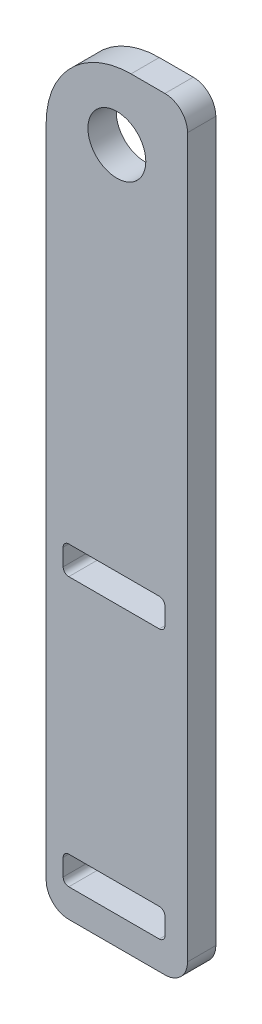
ISO-10303-21;
HEADER;
FILE_DESCRIPTION(('STEP AP214'),'2;1');
FILE_NAME('part.step','',(''),(''),'','','');
FILE_SCHEMA(('AUTOMOTIVE_DESIGN { 1 0 10303 214 1 1 1 1 }'));
ENDSEC;
DATA;
#1=APPLICATION_CONTEXT('core data for automotive mechanical design processes');
#2=APPLICATION_PROTOCOL_DEFINITION('international standard','automotive_design',2000,#1);
#3=PRODUCT_CONTEXT('',#1,'mechanical');
#4=PRODUCT('Part','Part','',(#3));
#5=PRODUCT_RELATED_PRODUCT_CATEGORY('part','',(#4));
#6=PRODUCT_DEFINITION_FORMATION('','',#4);
#7=PRODUCT_DEFINITION_CONTEXT('part definition',#1,'design');
#8=PRODUCT_DEFINITION('design','',#6,#7);
#9=PRODUCT_DEFINITION_SHAPE('','',#8);
#10=(LENGTH_UNIT() NAMED_UNIT(*) SI_UNIT(.MILLI.,.METRE.));
#11=(NAMED_UNIT(*) PLANE_ANGLE_UNIT() SI_UNIT($,.RADIAN.));
#12=(NAMED_UNIT(*) SI_UNIT($,.STERADIAN.) SOLID_ANGLE_UNIT());
#13=UNCERTAINTY_MEASURE_WITH_UNIT(LENGTH_MEASURE(1.E-05),#10,'distance_accuracy_value','');
#14=(GEOMETRIC_REPRESENTATION_CONTEXT(3) GLOBAL_UNCERTAINTY_ASSIGNED_CONTEXT((#13)) GLOBAL_UNIT_ASSIGNED_CONTEXT((#10,
#11,#12)) REPRESENTATION_CONTEXT('',''));
#15=CARTESIAN_POINT('',(0.,0.,0.));
#16=DIRECTION('',(0.,0.,1.));
#17=DIRECTION('',(1.,0.,0.));
#18=AXIS2_PLACEMENT_3D('',#15,#16,#17);
#19=CARTESIAN_POINT('',(1.5875,-1.830947062,3.175));
#20=DIRECTION('',(0.,0.,-1.));
#21=DIRECTION('',(-1.,0.,0.));
#22=AXIS2_PLACEMENT_3D('',#19,#20,#21);
#23=PLANE('',#22);
#24=CARTESIAN_POINT('',(4.76249999999999,-74.220947062,3.175));
#25=DIRECTION('',(0.,0.,1.));
#26=DIRECTION('',(-1.,0.,0.));
#27=AXIS2_PLACEMENT_3D('',#24,#25,#26);
#28=CIRCLE('',#27,0.634999999999999);
#29=CARTESIAN_POINT('',(4.76249999999999,-74.855947062,3.175));
#30=VERTEX_POINT('',#29);
#31=CARTESIAN_POINT('',(5.39749999999999,-74.220947062,3.175));
#32=VERTEX_POINT('',#31);
#33=EDGE_CURVE('E290',#30,#32,#28,.T.);
#34=ORIENTED_EDGE('',*,*,#33,.F.);
#35=DIRECTION('',(1.,0.,0.));
#36=VECTOR('',#35,1.);
#37=CARTESIAN_POINT('',(-5.39749999999999,-74.855947062,3.175));
#38=LINE('',#37,#36);
#39=CARTESIAN_POINT('',(-5.39749999999999,-74.855947062,3.175));
#40=VERTEX_POINT('',#39);
#41=EDGE_CURVE('E313',#40,#30,#38,.T.);
#42=ORIENTED_EDGE('',*,*,#41,.F.);
#43=CARTESIAN_POINT('',(-5.39749999999999,-74.220947062,3.175));
#44=DIRECTION('',(0.,0.,1.));
#45=DIRECTION('',(-1.,0.,0.));
#46=AXIS2_PLACEMENT_3D('',#43,#44,#45);
#47=CIRCLE('',#46,0.634999999999999);
#48=CARTESIAN_POINT('',(-6.03249999999999,-74.220947062,3.175));
#49=VERTEX_POINT('',#48);
#50=EDGE_CURVE('E309',#49,#40,#47,.T.);
#51=ORIENTED_EDGE('',*,*,#50,.F.);
#52=DIRECTION('',(0.,-1.,0.));
#53=VECTOR('',#52,1.);
#54=CARTESIAN_POINT('',(-6.0325,-72.315947062,3.175));
#55=LINE('',#54,#53);
#56=CARTESIAN_POINT('',(-6.0325,-72.315947062,3.175));
#57=VERTEX_POINT('',#56);
#58=EDGE_CURVE('E306',#57,#49,#55,.T.);
#59=ORIENTED_EDGE('',*,*,#58,.F.);
#60=CARTESIAN_POINT('',(-5.3975,-72.315947062,3.175));
#61=DIRECTION('',(0.,0.,1.));
#62=DIRECTION('',(-1.,0.,0.));
#63=AXIS2_PLACEMENT_3D('',#60,#61,#62);
#64=CIRCLE('',#63,0.634999999999998);
#65=CARTESIAN_POINT('',(-5.3975,-71.680947062,3.175));
#66=VERTEX_POINT('',#65);
#67=EDGE_CURVE('E303',#66,#57,#64,.T.);
#68=ORIENTED_EDGE('',*,*,#67,.F.);
#69=DIRECTION('',(-1.,0.,0.));
#70=VECTOR('',#69,1.);
#71=CARTESIAN_POINT('',(-5.3975,-71.680947062,3.175));
#72=LINE('',#71,#70);
#73=CARTESIAN_POINT('',(4.7625,-71.680947062,3.175));
#74=VERTEX_POINT('',#73);
#75=EDGE_CURVE('E300',#74,#66,#72,.T.);
#76=ORIENTED_EDGE('',*,*,#75,.F.);
#77=CARTESIAN_POINT('',(4.7625,-72.315947062,3.175));
#78=DIRECTION('',(0.,0.,1.));
#79=DIRECTION('',(1.,0.,0.));
#80=AXIS2_PLACEMENT_3D('',#77,#78,#79);
#81=CIRCLE('',#80,0.634999999999999);
#82=CARTESIAN_POINT('',(5.3975,-72.315947062,3.175));
#83=VERTEX_POINT('',#82);
#84=EDGE_CURVE('E297',#83,#74,#81,.T.);
#85=ORIENTED_EDGE('',*,*,#84,.F.);
#86=DIRECTION('',(0.,1.,0.));
#87=VECTOR('',#86,1.);
#88=CARTESIAN_POINT('',(5.3975,-72.315947062,3.175));
#89=LINE('',#88,#87);
#90=EDGE_CURVE('E293',#32,#83,#89,.T.);
#91=ORIENTED_EDGE('',*,*,#90,.F.);
#92=EDGE_LOOP('',(#34,#42,#51,#59,#68,#76,#85,#91));
#93=FACE_BOUND('',#92,.T.);
#94=CARTESIAN_POINT('',(1.5875,-1.830947062,3.175));
#95=DIRECTION('',(0.,0.,1.));
#96=DIRECTION('',(-1.,0.,0.));
#97=AXIS2_PLACEMENT_3D('',#94,#95,#96);
#98=CIRCLE('',#97,9.525);
#99=CARTESIAN_POINT('',(1.5875,7.694052938,3.175));
#100=VERTEX_POINT('',#99);
#101=CARTESIAN_POINT('',(-7.9375,-1.830947062,3.175));
#102=VERTEX_POINT('',#101);
#103=EDGE_CURVE('E381',#100,#102,#98,.T.);
#104=ORIENTED_EDGE('',*,*,#103,.T.);
#105=DIRECTION('',(0.,-1.,0.));
#106=VECTOR('',#105,1.);
#107=CARTESIAN_POINT('',(-7.9375,-1.830947062,3.175));
#108=LINE('',#107,#106);
#109=CARTESIAN_POINT('',(-7.93749999999999,-75.490947062,3.175));
#110=VERTEX_POINT('',#109);
#111=EDGE_CURVE('E385',#102,#110,#108,.T.);
#112=ORIENTED_EDGE('',*,*,#111,.T.);
#113=CARTESIAN_POINT('',(-5.39749999999999,-75.490947062,3.175));
#114=DIRECTION('',(0.,0.,1.));
#115=DIRECTION('',(-1.,0.,0.));
#116=AXIS2_PLACEMENT_3D('',#113,#114,#115);
#117=CIRCLE('',#116,2.54);
#118=CARTESIAN_POINT('',(-5.39749999999999,-78.030947062,3.175));
#119=VERTEX_POINT('',#118);
#120=EDGE_CURVE('E389',#110,#119,#117,.T.);
#121=ORIENTED_EDGE('',*,*,#120,.T.);
#122=DIRECTION('',(1.,0.,0.));
#123=VECTOR('',#122,1.);
#124=CARTESIAN_POINT('',(-5.39749999999999,-78.030947062,3.175));
#125=LINE('',#124,#123);
#126=CARTESIAN_POINT('',(5.39749999999999,-78.030947062,3.175));
#127=VERTEX_POINT('',#126);
#128=EDGE_CURVE('E392',#119,#127,#125,.T.);
#129=ORIENTED_EDGE('',*,*,#128,.T.);
#130=CARTESIAN_POINT('',(5.39749999999999,-75.490947062,3.175));
#131=DIRECTION('',(0.,0.,1.));
#132=DIRECTION('',(-1.,0.,0.));
#133=AXIS2_PLACEMENT_3D('',#130,#131,#132);
#134=CIRCLE('',#133,2.54);
#135=CARTESIAN_POINT('',(7.93749999999999,-75.490947062,3.175));
#136=VERTEX_POINT('',#135);
#137=EDGE_CURVE('E395',#127,#136,#134,.T.);
#138=ORIENTED_EDGE('',*,*,#137,.T.);
#139=DIRECTION('',(0.,1.,0.));
#140=VECTOR('',#139,1.);
#141=CARTESIAN_POINT('',(7.93749999999999,-75.490947062,3.175));
#142=LINE('',#141,#140);
#143=CARTESIAN_POINT('',(7.9375,5.154052938,3.175));
#144=VERTEX_POINT('',#143);
#145=EDGE_CURVE('E398',#136,#144,#142,.T.);
#146=ORIENTED_EDGE('',*,*,#145,.T.);
#147=CARTESIAN_POINT('',(5.3975,5.154052938,3.175));
#148=DIRECTION('',(0.,0.,1.));
#149=DIRECTION('',(1.,0.,0.));
#150=AXIS2_PLACEMENT_3D('',#147,#148,#149);
#151=CIRCLE('',#150,2.54);
#152=CARTESIAN_POINT('',(5.3975,7.694052938,3.175));
#153=VERTEX_POINT('',#152);
#154=EDGE_CURVE('E401',#144,#153,#151,.T.);
#155=ORIENTED_EDGE('',*,*,#154,.T.);
#156=DIRECTION('',(-1.,0.,0.));
#157=VECTOR('',#156,1.);
#158=CARTESIAN_POINT('',(1.5875,7.694052938,3.175));
#159=LINE('',#158,#157);
#160=EDGE_CURVE('E404',#153,#100,#159,.T.);
#161=ORIENTED_EDGE('',*,*,#160,.T.);
#162=EDGE_LOOP('',(#104,#112,#121,#129,#138,#146,#155,#161));
#163=FACE_BOUND('',#162,.T.);
#164=CARTESIAN_POINT('',(0.,0.,3.175));
#165=DIRECTION('',(0.,0.,1.));
#166=DIRECTION('',(1.,0.,0.));
#167=AXIS2_PLACEMENT_3D('',#164,#165,#166);
#168=CIRCLE('',#167,3.25);
#169=CARTESIAN_POINT('',(3.25,0.,3.175));
#170=VERTEX_POINT('',#169);
#171=EDGE_CURVE('E373',#170,#170,#168,.T.);
#172=ORIENTED_EDGE('',*,*,#171,.F.);
#173=EDGE_LOOP('',(#172));
#174=FACE_BOUND('',#173,.T.);
#175=CARTESIAN_POINT('',(-5.3975,-42.153447062,3.175));
#176=DIRECTION('',(0.,0.,1.));
#177=DIRECTION('',(1.,0.,0.));
#178=AXIS2_PLACEMENT_3D('',#175,#176,#177);
#179=CIRCLE('',#178,0.634999999999999);
#180=CARTESIAN_POINT('',(-5.3975,-41.518447062,3.175));
#181=VERTEX_POINT('',#180);
#182=CARTESIAN_POINT('',(-6.0325,-42.153447062,3.175));
#183=VERTEX_POINT('',#182);
#184=EDGE_CURVE('E201',#181,#183,#179,.T.);
#185=ORIENTED_EDGE('',*,*,#184,.F.);
#186=DIRECTION('',(-1.,0.,0.));
#187=VECTOR('',#186,1.);
#188=CARTESIAN_POINT('',(-5.3975,-41.518447062,3.175));
#189=LINE('',#188,#187);
#190=CARTESIAN_POINT('',(4.7625,-41.518447062,3.175));
#191=VERTEX_POINT('',#190);
#192=EDGE_CURVE('E242',#191,#181,#189,.T.);
#193=ORIENTED_EDGE('',*,*,#192,.F.);
#194=CARTESIAN_POINT('',(4.7625,-42.153447062,3.175));
#195=DIRECTION('',(0.,0.,1.));
#196=DIRECTION('',(1.,0.,0.));
#197=AXIS2_PLACEMENT_3D('',#194,#195,#196);
#198=CIRCLE('',#197,0.634999999999998);
#199=CARTESIAN_POINT('',(5.3975,-42.153447062,3.175));
#200=VERTEX_POINT('',#199);
#201=EDGE_CURVE('E239',#200,#191,#198,.T.);
#202=ORIENTED_EDGE('',*,*,#201,.F.);
#203=DIRECTION('',(0.,1.,0.));
#204=VECTOR('',#203,1.);
#205=CARTESIAN_POINT('',(5.3975,-44.058447062,3.175));
#206=LINE('',#205,#204);
#207=CARTESIAN_POINT('',(5.3975,-44.058447062,3.175));
#208=VERTEX_POINT('',#207);
#209=EDGE_CURVE('E236',#208,#200,#206,.T.);
#210=ORIENTED_EDGE('',*,*,#209,.F.);
#211=CARTESIAN_POINT('',(4.7625,-44.058447062,3.175));
#212=DIRECTION('',(0.,0.,1.));
#213=DIRECTION('',(-1.,0.,0.));
#214=AXIS2_PLACEMENT_3D('',#211,#212,#213);
#215=CIRCLE('',#214,0.634999999999999);
#216=CARTESIAN_POINT('',(4.7625,-44.693447062,3.175));
#217=VERTEX_POINT('',#216);
#218=EDGE_CURVE('E233',#217,#208,#215,.T.);
#219=ORIENTED_EDGE('',*,*,#218,.F.);
#220=DIRECTION('',(1.,0.,0.));
#221=VECTOR('',#220,1.);
#222=CARTESIAN_POINT('',(-5.3975,-44.693447062,3.175));
#223=LINE('',#222,#221);
#224=CARTESIAN_POINT('',(-5.3975,-44.693447062,3.175));
#225=VERTEX_POINT('',#224);
#226=EDGE_CURVE('E228',#225,#217,#223,.T.);
#227=ORIENTED_EDGE('',*,*,#226,.F.);
#228=CARTESIAN_POINT('',(-5.3975,-44.058447062,3.175));
#229=DIRECTION('',(0.,0.,1.));
#230=DIRECTION('',(1.,0.,0.));
#231=AXIS2_PLACEMENT_3D('',#228,#229,#230);
#232=CIRCLE('',#231,0.634999999999998);
#233=CARTESIAN_POINT('',(-6.0325,-44.058447062,3.175));
#234=VERTEX_POINT('',#233);
#235=EDGE_CURVE('E224',#234,#225,#232,.T.);
#236=ORIENTED_EDGE('',*,*,#235,.F.);
#237=DIRECTION('',(0.,-1.,0.));
#238=VECTOR('',#237,1.);
#239=CARTESIAN_POINT('',(-6.0325,-44.058447062,3.175));
#240=LINE('',#239,#238);
#241=EDGE_CURVE('E210',#183,#234,#240,.T.);
#242=ORIENTED_EDGE('',*,*,#241,.F.);
#243=EDGE_LOOP('',(#185,#193,#202,#210,#219,#227,#236,#242));
#244=FACE_BOUND('',#243,.T.);
#245=ADVANCED_FACE('F39',(#93,#163,#174,#244),#23,.F.);
#246=CARTESIAN_POINT('',(1.5875,-1.830947062,0.));
#247=DIRECTION('',(0.,0.,-1.));
#248=DIRECTION('',(-1.,0.,0.));
#249=AXIS2_PLACEMENT_3D('',#246,#247,#248);
#250=PLANE('',#249);
#251=CARTESIAN_POINT('',(1.5875,-1.830947062,0.));
#252=DIRECTION('',(0.,0.,1.));
#253=DIRECTION('',(-1.,0.,0.));
#254=AXIS2_PLACEMENT_3D('',#251,#252,#253);
#255=CIRCLE('',#254,9.525);
#256=CARTESIAN_POINT('',(1.5875,7.694052938,0.));
#257=VERTEX_POINT('',#256);
#258=CARTESIAN_POINT('',(-7.9375,-1.830947062,0.));
#259=VERTEX_POINT('',#258);
#260=EDGE_CURVE('E377',#257,#259,#255,.T.);
#261=ORIENTED_EDGE('',*,*,#260,.F.);
#262=DIRECTION('',(-1.,0.,0.));
#263=VECTOR('',#262,1.);
#264=CARTESIAN_POINT('',(1.5875,7.694052938,0.));
#265=LINE('',#264,#263);
#266=CARTESIAN_POINT('',(5.3975,7.694052938,0.));
#267=VERTEX_POINT('',#266);
#268=EDGE_CURVE('E386',#267,#257,#265,.T.);
#269=ORIENTED_EDGE('',*,*,#268,.F.);
#270=CARTESIAN_POINT('',(5.3975,5.154052938,0.));
#271=DIRECTION('',(0.,0.,1.));
#272=DIRECTION('',(1.,0.,0.));
#273=AXIS2_PLACEMENT_3D('',#270,#271,#272);
#274=CIRCLE('',#273,2.54);
#275=CARTESIAN_POINT('',(7.9375,5.154052938,0.));
#276=VERTEX_POINT('',#275);
#277=EDGE_CURVE('E426',#276,#267,#274,.T.);
#278=ORIENTED_EDGE('',*,*,#277,.F.);
#279=DIRECTION('',(0.,1.,0.));
#280=VECTOR('',#279,1.);
#281=CARTESIAN_POINT('',(7.93749999999999,-75.490947062,0.));
#282=LINE('',#281,#280);
#283=CARTESIAN_POINT('',(7.93749999999999,-75.490947062,0.));
#284=VERTEX_POINT('',#283);
#285=EDGE_CURVE('E423',#284,#276,#282,.T.);
#286=ORIENTED_EDGE('',*,*,#285,.F.);
#287=CARTESIAN_POINT('',(5.39749999999999,-75.490947062,0.));
#288=DIRECTION('',(0.,0.,1.));
#289=DIRECTION('',(-1.,0.,0.));
#290=AXIS2_PLACEMENT_3D('',#287,#288,#289);
#291=CIRCLE('',#290,2.54);
#292=CARTESIAN_POINT('',(5.39749999999999,-78.030947062,0.));
#293=VERTEX_POINT('',#292);
#294=EDGE_CURVE('E420',#293,#284,#291,.T.);
#295=ORIENTED_EDGE('',*,*,#294,.F.);
#296=DIRECTION('',(1.,0.,0.));
#297=VECTOR('',#296,1.);
#298=CARTESIAN_POINT('',(-5.39749999999999,-78.030947062,0.));
#299=LINE('',#298,#297);
#300=CARTESIAN_POINT('',(-5.39749999999999,-78.030947062,0.));
#301=VERTEX_POINT('',#300);
#302=EDGE_CURVE('E417',#301,#293,#299,.T.);
#303=ORIENTED_EDGE('',*,*,#302,.F.);
#304=CARTESIAN_POINT('',(-5.39749999999999,-75.490947062,0.));
#305=DIRECTION('',(0.,0.,1.));
#306=DIRECTION('',(-1.,0.,0.));
#307=AXIS2_PLACEMENT_3D('',#304,#305,#306);
#308=CIRCLE('',#307,2.54);
#309=CARTESIAN_POINT('',(-7.93749999999999,-75.490947062,0.));
#310=VERTEX_POINT('',#309);
#311=EDGE_CURVE('E414',#310,#301,#308,.T.);
#312=ORIENTED_EDGE('',*,*,#311,.F.);
#313=DIRECTION('',(0.,-1.,0.));
#314=VECTOR('',#313,1.);
#315=CARTESIAN_POINT('',(-7.9375,-1.830947062,0.));
#316=LINE('',#315,#314);
#317=EDGE_CURVE('E411',#259,#310,#316,.T.);
#318=ORIENTED_EDGE('',*,*,#317,.F.);
#319=EDGE_LOOP('',(#261,#269,#278,#286,#295,#303,#312,#318));
#320=FACE_BOUND('',#319,.T.);
#321=CARTESIAN_POINT('',(0.,0.,0.));
#322=DIRECTION('',(0.,0.,1.));
#323=DIRECTION('',(1.,0.,0.));
#324=AXIS2_PLACEMENT_3D('',#321,#322,#323);
#325=CIRCLE('',#324,3.25);
#326=CARTESIAN_POINT('',(3.25,0.,0.));
#327=VERTEX_POINT('',#326);
#328=EDGE_CURVE('E372',#327,#327,#325,.T.);
#329=ORIENTED_EDGE('',*,*,#328,.T.);
#330=EDGE_LOOP('',(#329));
#331=FACE_BOUND('',#330,.T.);
#332=DIRECTION('',(1.,0.,0.));
#333=VECTOR('',#332,1.);
#334=CARTESIAN_POINT('',(-5.39749999999999,-74.855947062,0.));
#335=LINE('',#334,#333);
#336=CARTESIAN_POINT('',(-5.39749999999999,-74.855947062,0.));
#337=VERTEX_POINT('',#336);
#338=CARTESIAN_POINT('',(4.76249999999999,-74.855947062,0.));
#339=VERTEX_POINT('',#338);
#340=EDGE_CURVE('E294',#337,#339,#335,.T.);
#341=ORIENTED_EDGE('',*,*,#340,.T.);
#342=CARTESIAN_POINT('',(4.76249999999999,-74.220947062,0.));
#343=DIRECTION('',(0.,0.,1.));
#344=DIRECTION('',(-1.,0.,0.));
#345=AXIS2_PLACEMENT_3D('',#342,#343,#344);
#346=CIRCLE('',#345,0.634999999999999);
#347=CARTESIAN_POINT('',(5.39749999999999,-74.220947062,0.));
#348=VERTEX_POINT('',#347);
#349=EDGE_CURVE('E219',#339,#348,#346,.T.);
#350=ORIENTED_EDGE('',*,*,#349,.T.);
#351=DIRECTION('',(0.,1.,0.));
#352=VECTOR('',#351,1.);
#353=CARTESIAN_POINT('',(5.3975,-72.315947062,0.));
#354=LINE('',#353,#352);
#355=CARTESIAN_POINT('',(5.3975,-72.315947062,0.));
#356=VERTEX_POINT('',#355);
#357=EDGE_CURVE('E320',#348,#356,#354,.T.);
#358=ORIENTED_EDGE('',*,*,#357,.T.);
#359=CARTESIAN_POINT('',(4.7625,-72.315947062,0.));
#360=DIRECTION('',(0.,0.,1.));
#361=DIRECTION('',(1.,0.,0.));
#362=AXIS2_PLACEMENT_3D('',#359,#360,#361);
#363=CIRCLE('',#362,0.634999999999999);
#364=CARTESIAN_POINT('',(4.7625,-71.680947062,0.));
#365=VERTEX_POINT('',#364);
#366=EDGE_CURVE('E324',#356,#365,#363,.T.);
#367=ORIENTED_EDGE('',*,*,#366,.T.);
#368=DIRECTION('',(-1.,0.,0.));
#369=VECTOR('',#368,1.);
#370=CARTESIAN_POINT('',(-5.3975,-71.680947062,0.));
#371=LINE('',#370,#369);
#372=CARTESIAN_POINT('',(-5.3975,-71.680947062,0.));
#373=VERTEX_POINT('',#372);
#374=EDGE_CURVE('E328',#365,#373,#371,.T.);
#375=ORIENTED_EDGE('',*,*,#374,.T.);
#376=CARTESIAN_POINT('',(-5.3975,-72.315947062,0.));
#377=DIRECTION('',(0.,0.,1.));
#378=DIRECTION('',(-1.,0.,0.));
#379=AXIS2_PLACEMENT_3D('',#376,#377,#378);
#380=CIRCLE('',#379,0.634999999999998);
#381=CARTESIAN_POINT('',(-6.0325,-72.315947062,0.));
#382=VERTEX_POINT('',#381);
#383=EDGE_CURVE('E332',#373,#382,#380,.T.);
#384=ORIENTED_EDGE('',*,*,#383,.T.);
#385=DIRECTION('',(0.,-1.,0.));
#386=VECTOR('',#385,1.);
#387=CARTESIAN_POINT('',(-6.0325,-72.315947062,0.));
#388=LINE('',#387,#386);
#389=CARTESIAN_POINT('',(-6.03249999999999,-74.220947062,0.));
#390=VERTEX_POINT('',#389);
#391=EDGE_CURVE('E336',#382,#390,#388,.T.);
#392=ORIENTED_EDGE('',*,*,#391,.T.);
#393=CARTESIAN_POINT('',(-5.39749999999999,-74.220947062,0.));
#394=DIRECTION('',(0.,0.,1.));
#395=DIRECTION('',(-1.,0.,0.));
#396=AXIS2_PLACEMENT_3D('',#393,#394,#395);
#397=CIRCLE('',#396,0.634999999999999);
#398=EDGE_CURVE('E340',#390,#337,#397,.T.);
#399=ORIENTED_EDGE('',*,*,#398,.T.);
#400=EDGE_LOOP('',(#341,#350,#358,#367,#375,#384,#392,#399));
#401=FACE_BOUND('',#400,.T.);
#402=DIRECTION('',(-1.,0.,0.));
#403=VECTOR('',#402,1.);
#404=CARTESIAN_POINT('',(-5.3975,-41.518447062,0.));
#405=LINE('',#404,#403);
#406=CARTESIAN_POINT('',(4.7625,-41.518447062,0.));
#407=VERTEX_POINT('',#406);
#408=CARTESIAN_POINT('',(-5.3975,-41.518447062,0.));
#409=VERTEX_POINT('',#408);
#410=EDGE_CURVE('E211',#407,#409,#405,.T.);
#411=ORIENTED_EDGE('',*,*,#410,.T.);
#412=CARTESIAN_POINT('',(-5.3975,-42.153447062,0.));
#413=DIRECTION('',(0.,0.,1.));
#414=DIRECTION('',(1.,0.,0.));
#415=AXIS2_PLACEMENT_3D('',#412,#413,#414);
#416=CIRCLE('',#415,0.634999999999999);
#417=CARTESIAN_POINT('',(-6.0325,-42.153447062,0.));
#418=VERTEX_POINT('',#417);
#419=EDGE_CURVE('E63',#409,#418,#416,.T.);
#420=ORIENTED_EDGE('',*,*,#419,.T.);
#421=DIRECTION('',(0.,-1.,0.));
#422=VECTOR('',#421,1.);
#423=CARTESIAN_POINT('',(-6.0325,-44.058447062,0.));
#424=LINE('',#423,#422);
#425=CARTESIAN_POINT('',(-6.0325,-44.058447062,0.));
#426=VERTEX_POINT('',#425);
#427=EDGE_CURVE('E217',#418,#426,#424,.T.);
#428=ORIENTED_EDGE('',*,*,#427,.T.);
#429=CARTESIAN_POINT('',(-5.3975,-44.058447062,0.));
#430=DIRECTION('',(0.,0.,1.));
#431=DIRECTION('',(1.,0.,0.));
#432=AXIS2_PLACEMENT_3D('',#429,#430,#431);
#433=CIRCLE('',#432,0.634999999999998);
#434=CARTESIAN_POINT('',(-5.3975,-44.693447062,0.));
#435=VERTEX_POINT('',#434);
#436=EDGE_CURVE('E249',#426,#435,#433,.T.);
#437=ORIENTED_EDGE('',*,*,#436,.T.);
#438=DIRECTION('',(1.,0.,0.));
#439=VECTOR('',#438,1.);
#440=CARTESIAN_POINT('',(-5.3975,-44.693447062,0.));
#441=LINE('',#440,#439);
#442=CARTESIAN_POINT('',(4.7625,-44.693447062,0.));
#443=VERTEX_POINT('',#442);
#444=EDGE_CURVE('E253',#435,#443,#441,.T.);
#445=ORIENTED_EDGE('',*,*,#444,.T.);
#446=CARTESIAN_POINT('',(4.7625,-44.058447062,0.));
#447=DIRECTION('',(0.,0.,1.));
#448=DIRECTION('',(-1.,0.,0.));
#449=AXIS2_PLACEMENT_3D('',#446,#447,#448);
#450=CIRCLE('',#449,0.634999999999999);
#451=CARTESIAN_POINT('',(5.3975,-44.058447062,0.));
#452=VERTEX_POINT('',#451);
#453=EDGE_CURVE('E257',#443,#452,#450,.T.);
#454=ORIENTED_EDGE('',*,*,#453,.T.);
#455=DIRECTION('',(0.,1.,0.));
#456=VECTOR('',#455,1.);
#457=CARTESIAN_POINT('',(5.3975,-44.058447062,0.));
#458=LINE('',#457,#456);
#459=CARTESIAN_POINT('',(5.3975,-42.153447062,0.));
#460=VERTEX_POINT('',#459);
#461=EDGE_CURVE('E261',#452,#460,#458,.T.);
#462=ORIENTED_EDGE('',*,*,#461,.T.);
#463=CARTESIAN_POINT('',(4.7625,-42.153447062,0.));
#464=DIRECTION('',(0.,0.,1.));
#465=DIRECTION('',(1.,0.,0.));
#466=AXIS2_PLACEMENT_3D('',#463,#464,#465);
#467=CIRCLE('',#466,0.634999999999998);
#468=EDGE_CURVE('E265',#460,#407,#467,.T.);
#469=ORIENTED_EDGE('',*,*,#468,.T.);
#470=EDGE_LOOP('',(#411,#420,#428,#437,#445,#454,#462,#469));
#471=FACE_BOUND('',#470,.T.);
#472=ADVANCED_FACE('F465',(#320,#331,#401,#471),#250,.T.);
#473=CARTESIAN_POINT('',(1.5875,-1.830947062,3.175));
#474=DIRECTION('',(0.,0.,-1.));
#475=DIRECTION('',(-1.,0.,0.));
#476=AXIS2_PLACEMENT_3D('',#473,#474,#475);
#477=CYLINDRICAL_SURFACE('',#476,9.525);
#478=ORIENTED_EDGE('',*,*,#260,.T.);
#479=DIRECTION('',(0.,0.,-1.));
#480=VECTOR('',#479,1.);
#481=CARTESIAN_POINT('',(-7.9375,-1.830947062,3.175));
#482=LINE('',#481,#480);
#483=EDGE_CURVE('E11',#102,#259,#482,.T.);
#484=ORIENTED_EDGE('',*,*,#483,.F.);
#485=ORIENTED_EDGE('',*,*,#103,.F.);
#486=DIRECTION('',(0.,0.,-1.));
#487=VECTOR('',#486,1.);
#488=CARTESIAN_POINT('',(1.5875,7.694052938,3.175));
#489=LINE('',#488,#487);
#490=EDGE_CURVE('E407',#100,#257,#489,.T.);
#491=ORIENTED_EDGE('',*,*,#490,.T.);
#492=EDGE_LOOP('',(#478,#484,#485,#491));
#493=FACE_BOUND('',#492,.T.);
#494=ADVANCED_FACE('F41',(#493),#477,.T.);
#495=CARTESIAN_POINT('',(-7.9375,-1.830947062,3.175));
#496=DIRECTION('',(1.,0.,0.));
#497=DIRECTION('',(0.,1.,0.));
#498=AXIS2_PLACEMENT_3D('',#495,#496,#497);
#499=PLANE('',#498);
#500=ORIENTED_EDGE('',*,*,#317,.T.);
#501=DIRECTION('',(0.,0.,-1.));
#502=VECTOR('',#501,1.);
#503=CARTESIAN_POINT('',(-7.93749999999999,-75.490947062,3.175));
#504=LINE('',#503,#502);
#505=EDGE_CURVE('E48',#110,#310,#504,.T.);
#506=ORIENTED_EDGE('',*,*,#505,.F.);
#507=ORIENTED_EDGE('',*,*,#111,.F.);
#508=ORIENTED_EDGE('',*,*,#483,.T.);
#509=EDGE_LOOP('',(#500,#506,#507,#508));
#510=FACE_BOUND('',#509,.T.);
#511=ADVANCED_FACE('F483',(#510),#499,.F.);
#512=CARTESIAN_POINT('',(-5.39749999999999,-75.490947062,3.175));
#513=DIRECTION('',(0.,0.,-1.));
#514=DIRECTION('',(-1.,0.,0.));
#515=AXIS2_PLACEMENT_3D('',#512,#513,#514);
#516=CYLINDRICAL_SURFACE('',#515,2.54);
#517=ORIENTED_EDGE('',*,*,#311,.T.);
#518=DIRECTION('',(0.,0.,-1.));
#519=VECTOR('',#518,1.);
#520=CARTESIAN_POINT('',(-5.39749999999999,-78.030947062,3.175));
#521=LINE('',#520,#519);
#522=EDGE_CURVE('E450',#119,#301,#521,.T.);
#523=ORIENTED_EDGE('',*,*,#522,.F.);
#524=ORIENTED_EDGE('',*,*,#120,.F.);
#525=ORIENTED_EDGE('',*,*,#505,.T.);
#526=EDGE_LOOP('',(#517,#523,#524,#525));
#527=FACE_BOUND('',#526,.T.);
#528=ADVANCED_FACE('F459',(#527),#516,.T.);
#529=CARTESIAN_POINT('',(-5.39749999999999,-78.030947062,3.175));
#530=DIRECTION('',(0.,1.,0.));
#531=DIRECTION('',(0.,0.,1.));
#532=AXIS2_PLACEMENT_3D('',#529,#530,#531);
#533=PLANE('',#532);
#534=ORIENTED_EDGE('',*,*,#302,.T.);
#535=DIRECTION('',(0.,0.,-1.));
#536=VECTOR('',#535,1.);
#537=CARTESIAN_POINT('',(5.39749999999999,-78.030947062,3.175));
#538=LINE('',#537,#536);
#539=EDGE_CURVE('E446',#127,#293,#538,.T.);
#540=ORIENTED_EDGE('',*,*,#539,.F.);
#541=ORIENTED_EDGE('',*,*,#128,.F.);
#542=ORIENTED_EDGE('',*,*,#522,.T.);
#543=EDGE_LOOP('',(#534,#540,#541,#542));
#544=FACE_BOUND('',#543,.T.);
#545=ADVANCED_FACE('F471',(#544),#533,.F.);
#546=CARTESIAN_POINT('',(5.39749999999999,-75.490947062,3.175));
#547=DIRECTION('',(0.,0.,-1.));
#548=DIRECTION('',(-1.,0.,0.));
#549=AXIS2_PLACEMENT_3D('',#546,#547,#548);
#550=CYLINDRICAL_SURFACE('',#549,2.54);
#551=ORIENTED_EDGE('',*,*,#294,.T.);
#552=DIRECTION('',(0.,0.,-1.));
#553=VECTOR('',#552,1.);
#554=CARTESIAN_POINT('',(7.93749999999999,-75.490947062,3.175));
#555=LINE('',#554,#553);
#556=EDGE_CURVE('E442',#136,#284,#555,.T.);
#557=ORIENTED_EDGE('',*,*,#556,.F.);
#558=ORIENTED_EDGE('',*,*,#137,.F.);
#559=ORIENTED_EDGE('',*,*,#539,.T.);
#560=EDGE_LOOP('',(#551,#557,#558,#559));
#561=FACE_BOUND('',#560,.T.);
#562=ADVANCED_FACE('F475',(#561),#550,.T.);
#563=CARTESIAN_POINT('',(7.93749999999999,-75.490947062,3.175));
#564=DIRECTION('',(-1.,0.,0.));
#565=DIRECTION('',(0.,-1.,0.));
#566=AXIS2_PLACEMENT_3D('',#563,#564,#565);
#567=PLANE('',#566);
#568=ORIENTED_EDGE('',*,*,#285,.T.);
#569=DIRECTION('',(0.,0.,-1.));
#570=VECTOR('',#569,1.);
#571=CARTESIAN_POINT('',(7.9375,5.154052938,3.175));
#572=LINE('',#571,#570);
#573=EDGE_CURVE('E438',#144,#276,#572,.T.);
#574=ORIENTED_EDGE('',*,*,#573,.F.);
#575=ORIENTED_EDGE('',*,*,#145,.F.);
#576=ORIENTED_EDGE('',*,*,#556,.T.);
#577=EDGE_LOOP('',(#568,#574,#575,#576));
#578=FACE_BOUND('',#577,.T.);
#579=ADVANCED_FACE('F496',(#578),#567,.F.);
#580=CARTESIAN_POINT('',(5.3975,5.154052938,3.175));
#581=DIRECTION('',(0.,0.,-1.));
#582=DIRECTION('',(-1.,0.,0.));
#583=AXIS2_PLACEMENT_3D('',#580,#581,#582);
#584=CYLINDRICAL_SURFACE('',#583,2.54);
#585=ORIENTED_EDGE('',*,*,#277,.T.);
#586=DIRECTION('',(0.,0.,-1.));
#587=VECTOR('',#586,1.);
#588=CARTESIAN_POINT('',(5.3975,7.694052938,3.175));
#589=LINE('',#588,#587);
#590=EDGE_CURVE('E434',#153,#267,#589,.T.);
#591=ORIENTED_EDGE('',*,*,#590,.F.);
#592=ORIENTED_EDGE('',*,*,#154,.F.);
#593=ORIENTED_EDGE('',*,*,#573,.T.);
#594=EDGE_LOOP('',(#585,#591,#592,#593));
#595=FACE_BOUND('',#594,.T.);
#596=ADVANCED_FACE('F494',(#595),#584,.T.);
#597=CARTESIAN_POINT('',(1.5875,7.694052938,3.175));
#598=DIRECTION('',(0.,-1.,0.));
#599=DIRECTION('',(0.,0.,-1.));
#600=AXIS2_PLACEMENT_3D('',#597,#598,#599);
#601=PLANE('',#600);
#602=ORIENTED_EDGE('',*,*,#268,.T.);
#603=ORIENTED_EDGE('',*,*,#490,.F.);
#604=ORIENTED_EDGE('',*,*,#160,.F.);
#605=ORIENTED_EDGE('',*,*,#590,.T.);
#606=EDGE_LOOP('',(#602,#603,#604,#605));
#607=FACE_BOUND('',#606,.T.);
#608=ADVANCED_FACE('F489',(#607),#601,.F.);
#609=CARTESIAN_POINT('',(0.,0.,3.175));
#610=DIRECTION('',(0.,0.,-1.));
#611=DIRECTION('',(-1.,0.,0.));
#612=AXIS2_PLACEMENT_3D('',#609,#610,#611);
#613=CYLINDRICAL_SURFACE('',#612,3.25);
#614=ORIENTED_EDGE('',*,*,#171,.T.);
#615=EDGE_LOOP('',(#614));
#616=FACE_BOUND('',#615,.T.);
#617=ORIENTED_EDGE('',*,*,#328,.F.);
#618=EDGE_LOOP('',(#617));
#619=FACE_BOUND('',#618,.T.);
#620=ADVANCED_FACE('F514',(#616,#619),#613,.F.);
#621=CARTESIAN_POINT('',(4.76249999999999,-74.220947062,3.175));
#622=DIRECTION('',(0.,0.,-1.));
#623=DIRECTION('',(-1.,0.,0.));
#624=AXIS2_PLACEMENT_3D('',#621,#622,#623);
#625=CYLINDRICAL_SURFACE('',#624,0.634999999999999);
#626=ORIENTED_EDGE('',*,*,#349,.F.);
#627=DIRECTION('',(0.,0.,-1.));
#628=VECTOR('',#627,1.);
#629=CARTESIAN_POINT('',(4.76249999999999,-74.855947062,3.175));
#630=LINE('',#629,#628);
#631=EDGE_CURVE('E316',#30,#339,#630,.T.);
#632=ORIENTED_EDGE('',*,*,#631,.F.);
#633=ORIENTED_EDGE('',*,*,#33,.T.);
#634=DIRECTION('',(0.,0.,-1.));
#635=VECTOR('',#634,1.);
#636=CARTESIAN_POINT('',(5.39749999999999,-74.220947062,3.175));
#637=LINE('',#636,#635);
#638=EDGE_CURVE('E368',#32,#348,#637,.T.);
#639=ORIENTED_EDGE('',*,*,#638,.T.);
#640=EDGE_LOOP('',(#626,#632,#633,#639));
#641=FACE_BOUND('',#640,.T.);
#642=ADVANCED_FACE('F521',(#641),#625,.F.);
#643=CARTESIAN_POINT('',(5.3975,-72.315947062,3.175));
#644=DIRECTION('',(-1.,0.,0.));
#645=DIRECTION('',(0.,-1.,0.));
#646=AXIS2_PLACEMENT_3D('',#643,#644,#645);
#647=PLANE('',#646);
#648=ORIENTED_EDGE('',*,*,#357,.F.);
#649=ORIENTED_EDGE('',*,*,#638,.F.);
#650=ORIENTED_EDGE('',*,*,#90,.T.);
#651=DIRECTION('',(0.,0.,-1.));
#652=VECTOR('',#651,1.);
#653=CARTESIAN_POINT('',(5.3975,-72.315947062,3.175));
#654=LINE('',#653,#652);
#655=EDGE_CURVE('E365',#83,#356,#654,.T.);
#656=ORIENTED_EDGE('',*,*,#655,.T.);
#657=EDGE_LOOP('',(#648,#649,#650,#656));
#658=FACE_BOUND('',#657,.T.);
#659=ADVANCED_FACE('F526',(#658),#647,.T.);
#660=CARTESIAN_POINT('',(4.7625,-72.315947062,3.175));
#661=DIRECTION('',(0.,0.,-1.));
#662=DIRECTION('',(-1.,0.,0.));
#663=AXIS2_PLACEMENT_3D('',#660,#661,#662);
#664=CYLINDRICAL_SURFACE('',#663,0.634999999999999);
#665=ORIENTED_EDGE('',*,*,#366,.F.);
#666=ORIENTED_EDGE('',*,*,#655,.F.);
#667=ORIENTED_EDGE('',*,*,#84,.T.);
#668=DIRECTION('',(0.,0.,-1.));
#669=VECTOR('',#668,1.);
#670=CARTESIAN_POINT('',(4.7625,-71.680947062,3.175));
#671=LINE('',#670,#669);
#672=EDGE_CURVE('E362',#74,#365,#671,.T.);
#673=ORIENTED_EDGE('',*,*,#672,.T.);
#674=EDGE_LOOP('',(#665,#666,#667,#673));
#675=FACE_BOUND('',#674,.T.);
#676=ADVANCED_FACE('F588',(#675),#664,.F.);
#677=CARTESIAN_POINT('',(-5.3975,-71.680947062,3.175));
#678=DIRECTION('',(0.,-1.,0.));
#679=DIRECTION('',(0.,0.,-1.));
#680=AXIS2_PLACEMENT_3D('',#677,#678,#679);
#681=PLANE('',#680);
#682=ORIENTED_EDGE('',*,*,#374,.F.);
#683=ORIENTED_EDGE('',*,*,#672,.F.);
#684=ORIENTED_EDGE('',*,*,#75,.T.);
#685=DIRECTION('',(0.,0.,-1.));
#686=VECTOR('',#685,1.);
#687=CARTESIAN_POINT('',(-5.3975,-71.680947062,3.175));
#688=LINE('',#687,#686);
#689=EDGE_CURVE('E359',#66,#373,#688,.T.);
#690=ORIENTED_EDGE('',*,*,#689,.T.);
#691=EDGE_LOOP('',(#682,#683,#684,#690));
#692=FACE_BOUND('',#691,.T.);
#693=ADVANCED_FACE('F584',(#692),#681,.T.);
#694=CARTESIAN_POINT('',(-5.3975,-72.315947062,3.175));
#695=DIRECTION('',(0.,0.,-1.));
#696=DIRECTION('',(-1.,0.,0.));
#697=AXIS2_PLACEMENT_3D('',#694,#695,#696);
#698=CYLINDRICAL_SURFACE('',#697,0.634999999999998);
#699=ORIENTED_EDGE('',*,*,#383,.F.);
#700=ORIENTED_EDGE('',*,*,#689,.F.);
#701=ORIENTED_EDGE('',*,*,#67,.T.);
#702=DIRECTION('',(0.,0.,-1.));
#703=VECTOR('',#702,1.);
#704=CARTESIAN_POINT('',(-6.0325,-72.315947062,3.175));
#705=LINE('',#704,#703);
#706=EDGE_CURVE('E356',#57,#382,#705,.T.);
#707=ORIENTED_EDGE('',*,*,#706,.T.);
#708=EDGE_LOOP('',(#699,#700,#701,#707));
#709=FACE_BOUND('',#708,.T.);
#710=ADVANCED_FACE('F580',(#709),#698,.F.);
#711=CARTESIAN_POINT('',(-6.0325,-72.315947062,3.175));
#712=DIRECTION('',(1.,0.,0.));
#713=DIRECTION('',(0.,1.,0.));
#714=AXIS2_PLACEMENT_3D('',#711,#712,#713);
#715=PLANE('',#714);
#716=ORIENTED_EDGE('',*,*,#391,.F.);
#717=ORIENTED_EDGE('',*,*,#706,.F.);
#718=ORIENTED_EDGE('',*,*,#58,.T.);
#719=DIRECTION('',(0.,0.,-1.));
#720=VECTOR('',#719,1.);
#721=CARTESIAN_POINT('',(-6.03249999999999,-74.220947062,3.175));
#722=LINE('',#721,#720);
#723=EDGE_CURVE('E353',#49,#390,#722,.T.);
#724=ORIENTED_EDGE('',*,*,#723,.T.);
#725=EDGE_LOOP('',(#716,#717,#718,#724));
#726=FACE_BOUND('',#725,.T.);
#727=ADVANCED_FACE('F576',(#726),#715,.T.);
#728=CARTESIAN_POINT('',(-5.39749999999999,-74.220947062,3.175));
#729=DIRECTION('',(0.,0.,-1.));
#730=DIRECTION('',(-1.,0.,0.));
#731=AXIS2_PLACEMENT_3D('',#728,#729,#730);
#732=CYLINDRICAL_SURFACE('',#731,0.634999999999999);
#733=ORIENTED_EDGE('',*,*,#398,.F.);
#734=ORIENTED_EDGE('',*,*,#723,.F.);
#735=ORIENTED_EDGE('',*,*,#50,.T.);
#736=DIRECTION('',(0.,0.,-1.));
#737=VECTOR('',#736,1.);
#738=CARTESIAN_POINT('',(-5.39749999999999,-74.855947062,3.175));
#739=LINE('',#738,#737);
#740=EDGE_CURVE('E350',#40,#337,#739,.T.);
#741=ORIENTED_EDGE('',*,*,#740,.T.);
#742=EDGE_LOOP('',(#733,#734,#735,#741));
#743=FACE_BOUND('',#742,.T.);
#744=ADVANCED_FACE('F572',(#743),#732,.F.);
#745=CARTESIAN_POINT('',(-5.39749999999999,-74.855947062,3.175));
#746=DIRECTION('',(0.,1.,0.));
#747=DIRECTION('',(0.,0.,1.));
#748=AXIS2_PLACEMENT_3D('',#745,#746,#747);
#749=PLANE('',#748);
#750=ORIENTED_EDGE('',*,*,#340,.F.);
#751=ORIENTED_EDGE('',*,*,#740,.F.);
#752=ORIENTED_EDGE('',*,*,#41,.T.);
#753=ORIENTED_EDGE('',*,*,#631,.T.);
#754=EDGE_LOOP('',(#750,#751,#752,#753));
#755=FACE_BOUND('',#754,.T.);
#756=ADVANCED_FACE('F569',(#755),#749,.T.);
#757=CARTESIAN_POINT('',(-5.3975,-42.153447062,3.175));
#758=DIRECTION('',(0.,0.,-1.));
#759=DIRECTION('',(-1.,0.,0.));
#760=AXIS2_PLACEMENT_3D('',#757,#758,#759);
#761=CYLINDRICAL_SURFACE('',#760,0.634999999999999);
#762=ORIENTED_EDGE('',*,*,#419,.F.);
#763=DIRECTION('',(0.,0.,-1.));
#764=VECTOR('',#763,1.);
#765=CARTESIAN_POINT('',(-5.3975,-41.518447062,3.175));
#766=LINE('',#765,#764);
#767=EDGE_CURVE('E205',#181,#409,#766,.T.);
#768=ORIENTED_EDGE('',*,*,#767,.F.);
#769=ORIENTED_EDGE('',*,*,#184,.T.);
#770=DIRECTION('',(0.,0.,-1.));
#771=VECTOR('',#770,1.);
#772=CARTESIAN_POINT('',(-6.0325,-42.153447062,3.175));
#773=LINE('',#772,#771);
#774=EDGE_CURVE('E204',#183,#418,#773,.T.);
#775=ORIENTED_EDGE('',*,*,#774,.T.);
#776=EDGE_LOOP('',(#762,#768,#769,#775));
#777=FACE_BOUND('',#776,.T.);
#778=ADVANCED_FACE('F203',(#777),#761,.F.);
#779=CARTESIAN_POINT('',(-6.0325,-44.058447062,3.175));
#780=DIRECTION('',(1.,0.,0.));
#781=DIRECTION('',(0.,1.,0.));
#782=AXIS2_PLACEMENT_3D('',#779,#780,#781);
#783=PLANE('',#782);
#784=ORIENTED_EDGE('',*,*,#427,.F.);
#785=ORIENTED_EDGE('',*,*,#774,.F.);
#786=ORIENTED_EDGE('',*,*,#241,.T.);
#787=DIRECTION('',(0.,0.,-1.));
#788=VECTOR('',#787,1.);
#789=CARTESIAN_POINT('',(-6.0325,-44.058447062,3.175));
#790=LINE('',#789,#788);
#791=EDGE_CURVE('E220',#234,#426,#790,.T.);
#792=ORIENTED_EDGE('',*,*,#791,.T.);
#793=EDGE_LOOP('',(#784,#785,#786,#792));
#794=FACE_BOUND('',#793,.T.);
#795=ADVANCED_FACE('F214',(#794),#783,.T.);
#796=CARTESIAN_POINT('',(-5.3975,-44.058447062,3.175));
#797=DIRECTION('',(0.,0.,-1.));
#798=DIRECTION('',(-1.,0.,0.));
#799=AXIS2_PLACEMENT_3D('',#796,#797,#798);
#800=CYLINDRICAL_SURFACE('',#799,0.634999999999998);
#801=ORIENTED_EDGE('',*,*,#436,.F.);
#802=ORIENTED_EDGE('',*,*,#791,.F.);
#803=ORIENTED_EDGE('',*,*,#235,.T.);
#804=DIRECTION('',(0.,0.,-1.));
#805=VECTOR('',#804,1.);
#806=CARTESIAN_POINT('',(-5.3975,-44.693447062,3.175));
#807=LINE('',#806,#805);
#808=EDGE_CURVE('E285',#225,#435,#807,.T.);
#809=ORIENTED_EDGE('',*,*,#808,.T.);
#810=EDGE_LOOP('',(#801,#802,#803,#809));
#811=FACE_BOUND('',#810,.T.);
#812=ADVANCED_FACE('F556',(#811),#800,.F.);
#813=CARTESIAN_POINT('',(-5.3975,-44.693447062,3.175));
#814=DIRECTION('',(0.,1.,0.));
#815=DIRECTION('',(0.,0.,1.));
#816=AXIS2_PLACEMENT_3D('',#813,#814,#815);
#817=PLANE('',#816);
#818=ORIENTED_EDGE('',*,*,#444,.F.);
#819=ORIENTED_EDGE('',*,*,#808,.F.);
#820=ORIENTED_EDGE('',*,*,#226,.T.);
#821=DIRECTION('',(0.,0.,-1.));
#822=VECTOR('',#821,1.);
#823=CARTESIAN_POINT('',(4.7625,-44.693447062,3.175));
#824=LINE('',#823,#822);
#825=EDGE_CURVE('E282',#217,#443,#824,.T.);
#826=ORIENTED_EDGE('',*,*,#825,.T.);
#827=EDGE_LOOP('',(#818,#819,#820,#826));
#828=FACE_BOUND('',#827,.T.);
#829=ADVANCED_FACE('F553',(#828),#817,.T.);
#830=CARTESIAN_POINT('',(4.7625,-44.058447062,3.175));
#831=DIRECTION('',(0.,0.,-1.));
#832=DIRECTION('',(-1.,0.,0.));
#833=AXIS2_PLACEMENT_3D('',#830,#831,#832);
#834=CYLINDRICAL_SURFACE('',#833,0.634999999999999);
#835=ORIENTED_EDGE('',*,*,#453,.F.);
#836=ORIENTED_EDGE('',*,*,#825,.F.);
#837=ORIENTED_EDGE('',*,*,#218,.T.);
#838=DIRECTION('',(0.,0.,-1.));
#839=VECTOR('',#838,1.);
#840=CARTESIAN_POINT('',(5.3975,-44.058447062,3.175));
#841=LINE('',#840,#839);
#842=EDGE_CURVE('E279',#208,#452,#841,.T.);
#843=ORIENTED_EDGE('',*,*,#842,.T.);
#844=EDGE_LOOP('',(#835,#836,#837,#843));
#845=FACE_BOUND('',#844,.T.);
#846=ADVANCED_FACE('F548',(#845),#834,.F.);
#847=CARTESIAN_POINT('',(5.3975,-44.058447062,3.175));
#848=DIRECTION('',(-1.,0.,0.));
#849=DIRECTION('',(0.,-1.,0.));
#850=AXIS2_PLACEMENT_3D('',#847,#848,#849);
#851=PLANE('',#850);
#852=ORIENTED_EDGE('',*,*,#461,.F.);
#853=ORIENTED_EDGE('',*,*,#842,.F.);
#854=ORIENTED_EDGE('',*,*,#209,.T.);
#855=DIRECTION('',(0.,0.,-1.));
#856=VECTOR('',#855,1.);
#857=CARTESIAN_POINT('',(5.3975,-42.153447062,3.175));
#858=LINE('',#857,#856);
#859=EDGE_CURVE('E276',#200,#460,#858,.T.);
#860=ORIENTED_EDGE('',*,*,#859,.T.);
#861=EDGE_LOOP('',(#852,#853,#854,#860));
#862=FACE_BOUND('',#861,.T.);
#863=ADVANCED_FACE('F544',(#862),#851,.T.);
#864=CARTESIAN_POINT('',(4.7625,-42.153447062,3.175));
#865=DIRECTION('',(0.,0.,-1.));
#866=DIRECTION('',(-1.,0.,0.));
#867=AXIS2_PLACEMENT_3D('',#864,#865,#866);
#868=CYLINDRICAL_SURFACE('',#867,0.634999999999998);
#869=ORIENTED_EDGE('',*,*,#468,.F.);
#870=ORIENTED_EDGE('',*,*,#859,.F.);
#871=ORIENTED_EDGE('',*,*,#201,.T.);
#872=DIRECTION('',(0.,0.,-1.));
#873=VECTOR('',#872,1.);
#874=CARTESIAN_POINT('',(4.7625,-41.518447062,3.175));
#875=LINE('',#874,#873);
#876=EDGE_CURVE('E55',#191,#407,#875,.T.);
#877=ORIENTED_EDGE('',*,*,#876,.T.);
#878=EDGE_LOOP('',(#869,#870,#871,#877));
#879=FACE_BOUND('',#878,.T.);
#880=ADVANCED_FACE('F541',(#879),#868,.F.);
#881=CARTESIAN_POINT('',(-5.3975,-41.518447062,3.175));
#882=DIRECTION('',(0.,-1.,0.));
#883=DIRECTION('',(0.,0.,-1.));
#884=AXIS2_PLACEMENT_3D('',#881,#882,#883);
#885=PLANE('',#884);
#886=ORIENTED_EDGE('',*,*,#410,.F.);
#887=ORIENTED_EDGE('',*,*,#876,.F.);
#888=ORIENTED_EDGE('',*,*,#192,.T.);
#889=ORIENTED_EDGE('',*,*,#767,.T.);
#890=EDGE_LOOP('',(#886,#887,#888,#889));
#891=FACE_BOUND('',#890,.T.);
#892=ADVANCED_FACE('F535',(#891),#885,.T.);
#893=CLOSED_SHELL('',(#245,#472,#494,#511,#528,#545,#562,#579,#596,#608,#620,#642,#659,#676,
#693,#710,#727,#744,#756,#778,#795,#812,#829,#846,#863,#880,#892));
#894=MANIFOLD_SOLID_BREP('B2',#893);
#895=ADVANCED_BREP_SHAPE_REPRESENTATION('',(#18,#894),#14);
#896=SHAPE_DEFINITION_REPRESENTATION(#9,#895);
ENDSEC;
END-ISO-10303-21;
